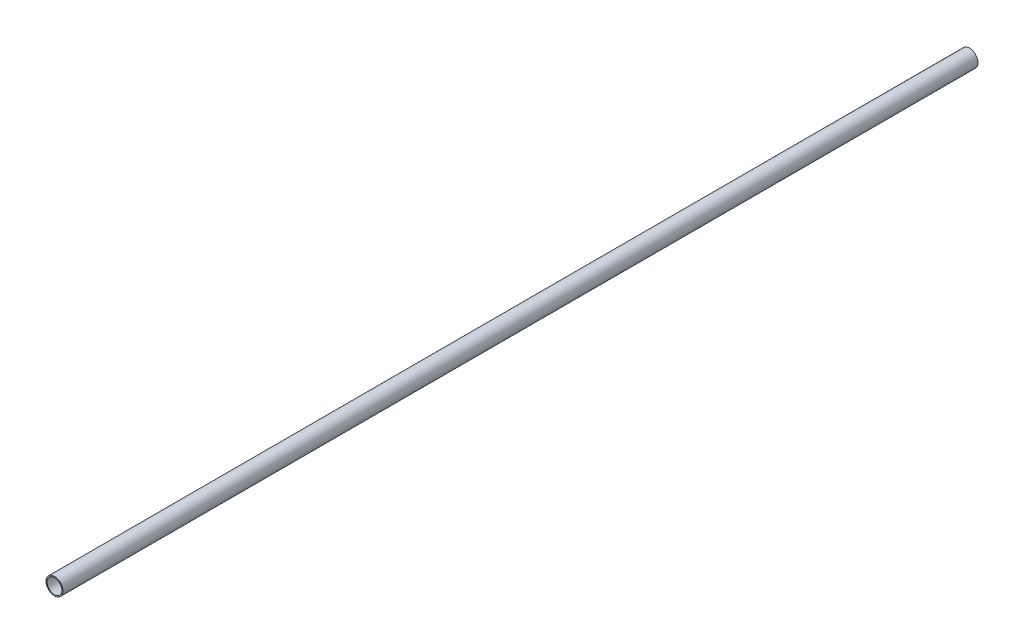
ISO-10303-21;
HEADER;
FILE_DESCRIPTION(('STEP AP214'),'2;1');
FILE_NAME('part.step','',(''),(''),'','','');
FILE_SCHEMA(('AUTOMOTIVE_DESIGN { 1 0 10303 214 1 1 1 1 }'));
ENDSEC;
DATA;
#1=APPLICATION_CONTEXT('core data for automotive mechanical design processes');
#2=APPLICATION_PROTOCOL_DEFINITION('international standard','automotive_design',2000,#1);
#3=PRODUCT_CONTEXT('',#1,'mechanical');
#4=PRODUCT('Part','Part','',(#3));
#5=PRODUCT_RELATED_PRODUCT_CATEGORY('part','',(#4));
#6=PRODUCT_DEFINITION_FORMATION('','',#4);
#7=PRODUCT_DEFINITION_CONTEXT('part definition',#1,'design');
#8=PRODUCT_DEFINITION('design','',#6,#7);
#9=PRODUCT_DEFINITION_SHAPE('','',#8);
#10=(LENGTH_UNIT() NAMED_UNIT(*) SI_UNIT(.MILLI.,.METRE.));
#11=(NAMED_UNIT(*) PLANE_ANGLE_UNIT() SI_UNIT($,.RADIAN.));
#12=(NAMED_UNIT(*) SI_UNIT($,.STERADIAN.) SOLID_ANGLE_UNIT());
#13=UNCERTAINTY_MEASURE_WITH_UNIT(LENGTH_MEASURE(1.E-05),#10,'distance_accuracy_value','');
#14=(GEOMETRIC_REPRESENTATION_CONTEXT(3) GLOBAL_UNCERTAINTY_ASSIGNED_CONTEXT((#13)) GLOBAL_UNIT_ASSIGNED_CONTEXT((#10,
#11,#12)) REPRESENTATION_CONTEXT('',''));
#15=CARTESIAN_POINT('',(0.,0.,0.));
#16=DIRECTION('',(0.,0.,1.));
#17=DIRECTION('',(1.,0.,0.));
#18=AXIS2_PLACEMENT_3D('',#15,#16,#17);
#19=CARTESIAN_POINT('',(0.,0.,1371.6));
#20=DIRECTION('',(0.,0.,1.));
#21=DIRECTION('',(1.,0.,0.));
#22=AXIS2_PLACEMENT_3D('',#19,#20,#21);
#23=PLANE('',#22);
#24=CARTESIAN_POINT('',(0.,0.,1371.6));
#25=DIRECTION('',(0.,0.,1.));
#26=DIRECTION('',(1.,0.,0.));
#27=AXIS2_PLACEMENT_3D('',#24,#25,#26);
#28=CIRCLE('',#27,12.7);
#29=CARTESIAN_POINT('',(12.7,0.,1371.6));
#30=VERTEX_POINT('',#29);
#31=EDGE_CURVE('E10',#30,#30,#28,.T.);
#32=ORIENTED_EDGE('',*,*,#31,.T.);
#33=EDGE_LOOP('',(#32));
#34=FACE_BOUND('',#33,.T.);
#35=CARTESIAN_POINT('',(0.,0.,1371.6));
#36=DIRECTION('',(0.,0.,1.));
#37=DIRECTION('',(1.,0.,0.));
#38=AXIS2_PLACEMENT_3D('',#35,#36,#37);
#39=CIRCLE('',#38,11.049);
#40=CARTESIAN_POINT('',(11.049,0.,1371.6));
#41=VERTEX_POINT('',#40);
#42=EDGE_CURVE('E43',#41,#41,#39,.T.);
#43=ORIENTED_EDGE('',*,*,#42,.F.);
#44=EDGE_LOOP('',(#43));
#45=FACE_BOUND('',#44,.T.);
#46=ADVANCED_FACE('F32',(#34,#45),#23,.T.);
#47=CARTESIAN_POINT('',(0.,0.,0.));
#48=DIRECTION('',(0.,0.,1.));
#49=DIRECTION('',(1.,0.,0.));
#50=AXIS2_PLACEMENT_3D('',#47,#48,#49);
#51=PLANE('',#50);
#52=CARTESIAN_POINT('',(0.,0.,0.));
#53=DIRECTION('',(0.,0.,1.));
#54=DIRECTION('',(1.,0.,0.));
#55=AXIS2_PLACEMENT_3D('',#52,#53,#54);
#56=CIRCLE('',#55,12.7);
#57=CARTESIAN_POINT('',(12.7,0.,0.));
#58=VERTEX_POINT('',#57);
#59=EDGE_CURVE('E36',#58,#58,#56,.T.);
#60=ORIENTED_EDGE('',*,*,#59,.F.);
#61=EDGE_LOOP('',(#60));
#62=FACE_BOUND('',#61,.T.);
#63=CARTESIAN_POINT('',(0.,0.,0.));
#64=DIRECTION('',(0.,0.,1.));
#65=DIRECTION('',(1.,0.,0.));
#66=AXIS2_PLACEMENT_3D('',#63,#64,#65);
#67=CIRCLE('',#66,11.049);
#68=CARTESIAN_POINT('',(11.049,0.,0.));
#69=VERTEX_POINT('',#68);
#70=EDGE_CURVE('E45',#69,#69,#67,.T.);
#71=ORIENTED_EDGE('',*,*,#70,.T.);
#72=EDGE_LOOP('',(#71));
#73=FACE_BOUND('',#72,.T.);
#74=ADVANCED_FACE('F55',(#62,#73),#51,.F.);
#75=CARTESIAN_POINT('',(0.,0.,1371.6));
#76=DIRECTION('',(0.,0.,-1.));
#77=DIRECTION('',(-1.,0.,0.));
#78=AXIS2_PLACEMENT_3D('',#75,#76,#77);
#79=CYLINDRICAL_SURFACE('',#78,12.7);
#80=ORIENTED_EDGE('',*,*,#31,.F.);
#81=EDGE_LOOP('',(#80));
#82=FACE_BOUND('',#81,.T.);
#83=ORIENTED_EDGE('',*,*,#59,.T.);
#84=EDGE_LOOP('',(#83));
#85=FACE_BOUND('',#84,.T.);
#86=ADVANCED_FACE('F34',(#82,#85),#79,.T.);
#87=CARTESIAN_POINT('',(0.,0.,1371.6));
#88=DIRECTION('',(0.,0.,-1.));
#89=DIRECTION('',(-1.,0.,0.));
#90=AXIS2_PLACEMENT_3D('',#87,#88,#89);
#91=CYLINDRICAL_SURFACE('',#90,11.049);
#92=ORIENTED_EDGE('',*,*,#42,.T.);
#93=EDGE_LOOP('',(#92));
#94=FACE_BOUND('',#93,.T.);
#95=ORIENTED_EDGE('',*,*,#70,.F.);
#96=EDGE_LOOP('',(#95));
#97=FACE_BOUND('',#96,.T.);
#98=ADVANCED_FACE('F51',(#94,#97),#91,.F.);
#99=CLOSED_SHELL('',(#46,#74,#86,#98));
#100=MANIFOLD_SOLID_BREP('B2',#99);
#101=ADVANCED_BREP_SHAPE_REPRESENTATION('',(#18,#100),#14);
#102=SHAPE_DEFINITION_REPRESENTATION(#9,#101);
ENDSEC;
END-ISO-10303-21;
